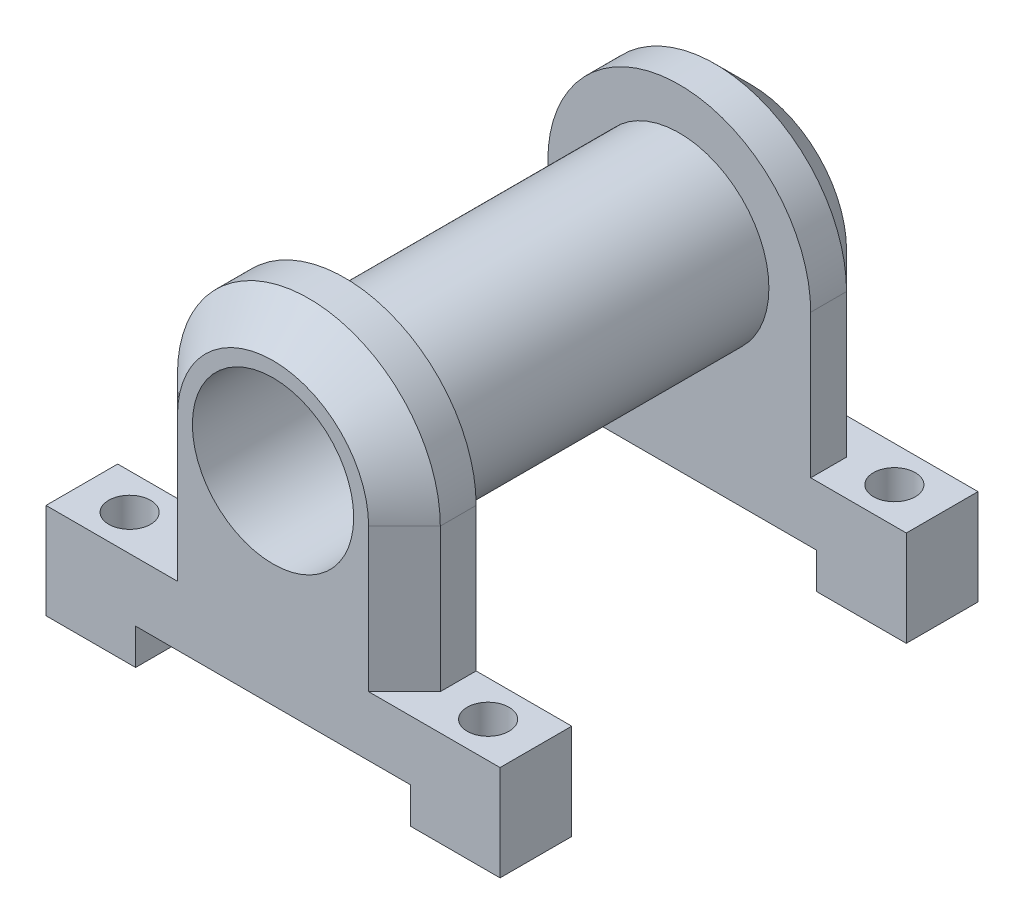
ISO-10303-21;
HEADER;
FILE_DESCRIPTION(('STEP AP214'),'2;1');
FILE_NAME('part.step','',(''),(''),'','','');
FILE_SCHEMA(('AUTOMOTIVE_DESIGN { 1 0 10303 214 1 1 1 1 }'));
ENDSEC;
DATA;
#1=APPLICATION_CONTEXT('core data for automotive mechanical design processes');
#2=APPLICATION_PROTOCOL_DEFINITION('international standard','automotive_design',2000,#1);
#3=PRODUCT_CONTEXT('',#1,'mechanical');
#4=PRODUCT('Part','Part','',(#3));
#5=PRODUCT_RELATED_PRODUCT_CATEGORY('part','',(#4));
#6=PRODUCT_DEFINITION_FORMATION('','',#4);
#7=PRODUCT_DEFINITION_CONTEXT('part definition',#1,'design');
#8=PRODUCT_DEFINITION('design','',#6,#7);
#9=PRODUCT_DEFINITION_SHAPE('','',#8);
#10=(LENGTH_UNIT() NAMED_UNIT(*) SI_UNIT(.MILLI.,.METRE.));
#11=(NAMED_UNIT(*) PLANE_ANGLE_UNIT() SI_UNIT($,.RADIAN.));
#12=(NAMED_UNIT(*) SI_UNIT($,.STERADIAN.) SOLID_ANGLE_UNIT());
#13=UNCERTAINTY_MEASURE_WITH_UNIT(LENGTH_MEASURE(1.E-05),#10,'distance_accuracy_value','');
#14=(GEOMETRIC_REPRESENTATION_CONTEXT(3) GLOBAL_UNCERTAINTY_ASSIGNED_CONTEXT((#13)) GLOBAL_UNIT_ASSIGNED_CONTEXT((#10,
#11,#12)) REPRESENTATION_CONTEXT('',''));
#15=CARTESIAN_POINT('',(0.,0.,0.));
#16=DIRECTION('',(0.,0.,1.));
#17=DIRECTION('',(1.,0.,0.));
#18=AXIS2_PLACEMENT_3D('',#15,#16,#17);
#19=CARTESIAN_POINT('',(11.,-20.,6.));
#20=DIRECTION('',(0.,1.,0.));
#21=DIRECTION('',(-1.,0.,0.));
#22=AXIS2_PLACEMENT_3D('',#19,#20,#21);
#23=PLANE('',#22);
#24=CARTESIAN_POINT('',(15.,-20.,3.));
#25=DIRECTION('',(0.,1.,0.));
#26=DIRECTION('',(0.,0.,1.));
#27=AXIS2_PLACEMENT_3D('',#24,#25,#26);
#28=CIRCLE('',#27,1.75);
#29=CARTESIAN_POINT('',(15.,-20.,4.75));
#30=VERTEX_POINT('',#29);
#31=EDGE_CURVE('E672',#30,#30,#28,.T.);
#32=ORIENTED_EDGE('',*,*,#31,.T.);
#33=EDGE_LOOP('',(#32));
#34=FACE_BOUND('',#33,.T.);
#35=DIRECTION('',(1.,0.,0.));
#36=VECTOR('',#35,1.);
#37=CARTESIAN_POINT('',(-11.,-20.,6.));
#38=LINE('',#37,#36);
#39=CARTESIAN_POINT('',(11.5,-20.,6.));
#40=VERTEX_POINT('',#39);
#41=CARTESIAN_POINT('',(19.,-20.,6.));
#42=VERTEX_POINT('',#41);
#43=EDGE_CURVE('E323',#40,#42,#38,.T.);
#44=ORIENTED_EDGE('',*,*,#43,.F.);
#45=DIRECTION('',(0.,0.,-1.));
#46=VECTOR('',#45,1.);
#47=CARTESIAN_POINT('',(11.5,-20.,40.));
#48=LINE('',#47,#46);
#49=CARTESIAN_POINT('',(11.5,-20.,0.));
#50=VERTEX_POINT('',#49);
#51=EDGE_CURVE('E242',#40,#50,#48,.T.);
#52=ORIENTED_EDGE('',*,*,#51,.T.);
#53=DIRECTION('',(1.,0.,0.));
#54=VECTOR('',#53,1.);
#55=CARTESIAN_POINT('',(11.,-20.,0.));
#56=LINE('',#55,#54);
#57=CARTESIAN_POINT('',(19.,-20.,0.));
#58=VERTEX_POINT('',#57);
#59=EDGE_CURVE('E343',#50,#58,#56,.T.);
#60=ORIENTED_EDGE('',*,*,#59,.T.);
#61=DIRECTION('',(0.,0.,-1.));
#62=VECTOR('',#61,1.);
#63=CARTESIAN_POINT('',(19.,-20.,6.));
#64=LINE('',#63,#62);
#65=EDGE_CURVE('E366',#42,#58,#64,.T.);
#66=ORIENTED_EDGE('',*,*,#65,.F.);
#67=EDGE_LOOP('',(#44,#52,#60,#66));
#68=FACE_BOUND('',#67,.T.);
#69=ADVANCED_FACE('F39',(#34,#68),#23,.F.);
#70=CARTESIAN_POINT('',(-19.,-20.,40.));
#71=DIRECTION('',(0.,1.,0.));
#72=DIRECTION('',(0.,0.,1.));
#73=AXIS2_PLACEMENT_3D('',#70,#71,#72);
#74=PLANE('',#73);
#75=CARTESIAN_POINT('',(15.0000000000004,-20.,37.));
#76=DIRECTION('',(0.,1.,0.));
#77=DIRECTION('',(0.,0.,1.));
#78=AXIS2_PLACEMENT_3D('',#75,#76,#77);
#79=CIRCLE('',#78,1.75);
#80=CARTESIAN_POINT('',(15.0000000000004,-20.,38.75));
#81=VERTEX_POINT('',#80);
#82=EDGE_CURVE('E415',#81,#81,#79,.T.);
#83=ORIENTED_EDGE('',*,*,#82,.T.);
#84=EDGE_LOOP('',(#83));
#85=FACE_BOUND('',#84,.T.);
#86=DIRECTION('',(1.,0.,0.));
#87=VECTOR('',#86,1.);
#88=CARTESIAN_POINT('',(-19.,-20.,40.));
#89=LINE('',#88,#87);
#90=CARTESIAN_POINT('',(11.5,-20.,40.));
#91=VERTEX_POINT('',#90);
#92=CARTESIAN_POINT('',(19.,-20.,40.));
#93=VERTEX_POINT('',#92);
#94=EDGE_CURVE('E247',#91,#93,#89,.T.);
#95=ORIENTED_EDGE('',*,*,#94,.F.);
#96=CARTESIAN_POINT('',(11.5,-20.,34.));
#97=VERTEX_POINT('',#96);
#98=EDGE_CURVE('E230',#91,#97,#48,.T.);
#99=ORIENTED_EDGE('',*,*,#98,.T.);
#100=DIRECTION('',(1.,0.,0.));
#101=VECTOR('',#100,1.);
#102=CARTESIAN_POINT('',(-19.,-20.,34.));
#103=LINE('',#102,#101);
#104=CARTESIAN_POINT('',(19.,-20.,34.));
#105=VERTEX_POINT('',#104);
#106=EDGE_CURVE('E278',#97,#105,#103,.T.);
#107=ORIENTED_EDGE('',*,*,#106,.T.);
#108=DIRECTION('',(0.,0.,-1.));
#109=VECTOR('',#108,1.);
#110=CARTESIAN_POINT('',(19.,-20.,40.));
#111=LINE('',#110,#109);
#112=EDGE_CURVE('E257',#93,#105,#111,.T.);
#113=ORIENTED_EDGE('',*,*,#112,.F.);
#114=EDGE_LOOP('',(#95,#99,#107,#113));
#115=FACE_BOUND('',#114,.T.);
#116=ADVANCED_FACE('F255',(#85,#115),#74,.F.);
#117=CARTESIAN_POINT('',(-19.,-20.,6.));
#118=DIRECTION('',(1.,0.,0.));
#119=DIRECTION('',(0.,0.,-1.));
#120=AXIS2_PLACEMENT_3D('',#117,#118,#119);
#121=PLANE('',#120);
#122=DIRECTION('',(0.,-1.,0.));
#123=VECTOR('',#122,1.);
#124=CARTESIAN_POINT('',(-19.,-20.,0.));
#125=LINE('',#124,#123);
#126=CARTESIAN_POINT('',(-19.,-12.,0.));
#127=VERTEX_POINT('',#126);
#128=CARTESIAN_POINT('',(-19.,-20.,0.));
#129=VERTEX_POINT('',#128);
#130=EDGE_CURVE('E317',#127,#129,#125,.T.);
#131=ORIENTED_EDGE('',*,*,#130,.T.);
#132=DIRECTION('',(0.,0.,-1.));
#133=VECTOR('',#132,1.);
#134=CARTESIAN_POINT('',(-19.,-20.,6.));
#135=LINE('',#134,#133);
#136=CARTESIAN_POINT('',(-19.,-20.,6.));
#137=VERTEX_POINT('',#136);
#138=EDGE_CURVE('E369',#137,#129,#135,.T.);
#139=ORIENTED_EDGE('',*,*,#138,.F.);
#140=DIRECTION('',(0.,-1.,0.));
#141=VECTOR('',#140,1.);
#142=CARTESIAN_POINT('',(-19.,-20.,6.));
#143=LINE('',#142,#141);
#144=CARTESIAN_POINT('',(-19.,-12.,6.));
#145=VERTEX_POINT('',#144);
#146=EDGE_CURVE('E320',#145,#137,#143,.T.);
#147=ORIENTED_EDGE('',*,*,#146,.F.);
#148=DIRECTION('',(0.,0.,-1.));
#149=VECTOR('',#148,1.);
#150=CARTESIAN_POINT('',(-19.,-12.,6.));
#151=LINE('',#150,#149);
#152=EDGE_CURVE('E340',#145,#127,#151,.T.);
#153=ORIENTED_EDGE('',*,*,#152,.T.);
#154=EDGE_LOOP('',(#131,#139,#147,#153));
#155=FACE_BOUND('',#154,.T.);
#156=ADVANCED_FACE('F461',(#155),#121,.F.);
#157=CARTESIAN_POINT('',(-15.,-20.,3.));
#158=DIRECTION('',(0.,1.,0.));
#159=DIRECTION('',(0.,0.,1.));
#160=AXIS2_PLACEMENT_3D('',#157,#158,#159);
#161=CIRCLE('',#160,1.75);
#162=CARTESIAN_POINT('',(-15.,-20.,4.75));
#163=VERTEX_POINT('',#162);
#164=EDGE_CURVE('E253',#163,#163,#161,.T.);
#165=ORIENTED_EDGE('',*,*,#164,.T.);
#166=EDGE_LOOP('',(#165));
#167=FACE_BOUND('',#166,.T.);
#168=CARTESIAN_POINT('',(-11.5,-20.,0.));
#169=VERTEX_POINT('',#168);
#170=EDGE_CURVE('E344',#129,#169,#56,.T.);
#171=ORIENTED_EDGE('',*,*,#170,.T.);
#172=DIRECTION('',(0.,0.,-1.));
#173=VECTOR('',#172,1.);
#174=CARTESIAN_POINT('',(-11.5,-20.,40.));
#175=LINE('',#174,#173);
#176=CARTESIAN_POINT('',(-11.5,-20.,6.));
#177=VERTEX_POINT('',#176);
#178=EDGE_CURVE('E241',#177,#169,#175,.T.);
#179=ORIENTED_EDGE('',*,*,#178,.F.);
#180=EDGE_CURVE('E325',#137,#177,#38,.T.);
#181=ORIENTED_EDGE('',*,*,#180,.F.);
#182=ORIENTED_EDGE('',*,*,#138,.T.);
#183=EDGE_LOOP('',(#171,#179,#181,#182));
#184=FACE_BOUND('',#183,.T.);
#185=ADVANCED_FACE('F457',(#167,#184),#23,.F.);
#186=CARTESIAN_POINT('',(19.,-20.,6.));
#187=DIRECTION('',(-1.,0.,0.));
#188=DIRECTION('',(0.,0.,1.));
#189=AXIS2_PLACEMENT_3D('',#186,#187,#188);
#190=PLANE('',#189);
#191=DIRECTION('',(0.,1.,0.));
#192=VECTOR('',#191,1.);
#193=CARTESIAN_POINT('',(19.,-20.,0.));
#194=LINE('',#193,#192);
#195=CARTESIAN_POINT('',(19.,-12.,0.));
#196=VERTEX_POINT('',#195);
#197=EDGE_CURVE('E347',#58,#196,#194,.T.);
#198=ORIENTED_EDGE('',*,*,#197,.T.);
#199=DIRECTION('',(0.,0.,-1.));
#200=VECTOR('',#199,1.);
#201=CARTESIAN_POINT('',(19.,-12.,6.));
#202=LINE('',#201,#200);
#203=CARTESIAN_POINT('',(19.,-12.,6.));
#204=VERTEX_POINT('',#203);
#205=EDGE_CURVE('E363',#204,#196,#202,.T.);
#206=ORIENTED_EDGE('',*,*,#205,.F.);
#207=DIRECTION('',(0.,1.,0.));
#208=VECTOR('',#207,1.);
#209=CARTESIAN_POINT('',(19.,-20.,6.));
#210=LINE('',#209,#208);
#211=EDGE_CURVE('E328',#42,#204,#210,.T.);
#212=ORIENTED_EDGE('',*,*,#211,.F.);
#213=ORIENTED_EDGE('',*,*,#65,.T.);
#214=EDGE_LOOP('',(#198,#206,#212,#213));
#215=FACE_BOUND('',#214,.T.);
#216=ADVANCED_FACE('F470',(#215),#190,.F.);
#217=CARTESIAN_POINT('',(11.,-12.,6.));
#218=DIRECTION('',(0.,-1.,0.));
#219=DIRECTION('',(0.,0.,-1.));
#220=AXIS2_PLACEMENT_3D('',#217,#218,#219);
#221=PLANE('',#220);
#222=CARTESIAN_POINT('',(15.,-12.,3.));
#223=DIRECTION('',(0.,1.,0.));
#224=DIRECTION('',(0.,0.,1.));
#225=AXIS2_PLACEMENT_3D('',#222,#223,#224);
#226=CIRCLE('',#225,1.75);
#227=CARTESIAN_POINT('',(15.,-12.,4.75));
#228=VERTEX_POINT('',#227);
#229=EDGE_CURVE('E669',#228,#228,#226,.T.);
#230=ORIENTED_EDGE('',*,*,#229,.F.);
#231=EDGE_LOOP('',(#230));
#232=FACE_BOUND('',#231,.T.);
#233=DIRECTION('',(-1.,0.,0.));
#234=VECTOR('',#233,1.);
#235=CARTESIAN_POINT('',(11.,-12.,0.));
#236=LINE('',#235,#234);
#237=CARTESIAN_POINT('',(7.99999999999999,-12.,0.));
#238=VERTEX_POINT('',#237);
#239=EDGE_CURVE('E349',#196,#238,#236,.T.);
#240=ORIENTED_EDGE('',*,*,#239,.T.);
#241=DIRECTION('',(-0.707106781186548,0.,-0.707106781186547));
#242=VECTOR('',#241,1.);
#243=CARTESIAN_POINT('',(12.5,-12.,4.5));
#244=LINE('',#243,#242);
#245=CARTESIAN_POINT('',(11.,-12.,3.));
#246=VERTEX_POINT('',#245);
#247=EDGE_CURVE('E49',#238,#246,#244,.F.);
#248=ORIENTED_EDGE('',*,*,#247,.T.);
#249=DIRECTION('',(0.,0.,-1.));
#250=VECTOR('',#249,1.);
#251=CARTESIAN_POINT('',(11.,-12.,6.));
#252=LINE('',#251,#250);
#253=CARTESIAN_POINT('',(11.,-12.,6.));
#254=VERTEX_POINT('',#253);
#255=EDGE_CURVE('E360',#254,#246,#252,.T.);
#256=ORIENTED_EDGE('',*,*,#255,.F.);
#257=DIRECTION('',(-1.,0.,0.));
#258=VECTOR('',#257,1.);
#259=CARTESIAN_POINT('',(11.,-12.,6.));
#260=LINE('',#259,#258);
#261=EDGE_CURVE('E330',#204,#254,#260,.T.);
#262=ORIENTED_EDGE('',*,*,#261,.F.);
#263=ORIENTED_EDGE('',*,*,#205,.T.);
#264=EDGE_LOOP('',(#240,#248,#256,#262,#263));
#265=FACE_BOUND('',#264,.T.);
#266=ADVANCED_FACE('F451',(#232,#265),#221,.F.);
#267=CARTESIAN_POINT('',(11.,-12.,6.));
#268=DIRECTION('',(-1.,0.,0.));
#269=DIRECTION('',(0.,-1.,0.));
#270=AXIS2_PLACEMENT_3D('',#267,#268,#269);
#271=PLANE('',#270);
#272=ORIENTED_EDGE('',*,*,#255,.T.);
#273=DIRECTION('',(0.,1.,0.));
#274=VECTOR('',#273,1.);
#275=CARTESIAN_POINT('',(11.,-12.,3.));
#276=LINE('',#275,#274);
#277=CARTESIAN_POINT('',(11.,0.,3.));
#278=VERTEX_POINT('',#277);
#279=EDGE_CURVE('E393',#246,#278,#276,.T.);
#280=ORIENTED_EDGE('',*,*,#279,.T.);
#281=DIRECTION('',(0.,0.,-1.));
#282=VECTOR('',#281,1.);
#283=CARTESIAN_POINT('',(11.,0.,6.));
#284=LINE('',#283,#282);
#285=CARTESIAN_POINT('',(11.,0.,6.));
#286=VERTEX_POINT('',#285);
#287=EDGE_CURVE('E358',#286,#278,#284,.T.);
#288=ORIENTED_EDGE('',*,*,#287,.F.);
#289=DIRECTION('',(0.,1.,0.));
#290=VECTOR('',#289,1.);
#291=CARTESIAN_POINT('',(11.,-12.,6.));
#292=LINE('',#291,#290);
#293=EDGE_CURVE('E332',#254,#286,#292,.T.);
#294=ORIENTED_EDGE('',*,*,#293,.F.);
#295=EDGE_LOOP('',(#272,#280,#288,#294));
#296=FACE_BOUND('',#295,.T.);
#297=ADVANCED_FACE('F444',(#296),#271,.F.);
#298=CARTESIAN_POINT('',(0.,0.,6.));
#299=DIRECTION('',(0.,0.,-1.));
#300=DIRECTION('',(-1.,0.,0.));
#301=AXIS2_PLACEMENT_3D('',#298,#299,#300);
#302=CYLINDRICAL_SURFACE('',#301,11.);
#303=ORIENTED_EDGE('',*,*,#287,.T.);
#304=CARTESIAN_POINT('',(0.,0.,3.));
#305=DIRECTION('',(0.,0.,1.));
#306=DIRECTION('',(1.,0.,0.));
#307=AXIS2_PLACEMENT_3D('',#304,#305,#306);
#308=CIRCLE('',#307,11.);
#309=CARTESIAN_POINT('',(-11.,0.,3.));
#310=VERTEX_POINT('',#309);
#311=EDGE_CURVE('E65',#278,#310,#308,.T.);
#312=ORIENTED_EDGE('',*,*,#311,.T.);
#313=DIRECTION('',(0.,0.,-1.));
#314=VECTOR('',#313,1.);
#315=CARTESIAN_POINT('',(-11.,0.,6.));
#316=LINE('',#315,#314);
#317=CARTESIAN_POINT('',(-11.,0.,6.));
#318=VERTEX_POINT('',#317);
#319=EDGE_CURVE('E356',#318,#310,#316,.T.);
#320=ORIENTED_EDGE('',*,*,#319,.F.);
#321=CARTESIAN_POINT('',(0.,0.,6.));
#322=DIRECTION('',(0.,0.,1.));
#323=DIRECTION('',(1.,0.,0.));
#324=AXIS2_PLACEMENT_3D('',#321,#322,#323);
#325=CIRCLE('',#324,11.);
#326=EDGE_CURVE('E334',#286,#318,#325,.T.);
#327=ORIENTED_EDGE('',*,*,#326,.F.);
#328=EDGE_LOOP('',(#303,#312,#320,#327));
#329=FACE_BOUND('',#328,.T.);
#330=ADVANCED_FACE('F442',(#329),#302,.T.);
#331=CARTESIAN_POINT('',(-11.,0.,6.));
#332=DIRECTION('',(1.,0.,0.));
#333=DIRECTION('',(0.,1.,0.));
#334=AXIS2_PLACEMENT_3D('',#331,#332,#333);
#335=PLANE('',#334);
#336=ORIENTED_EDGE('',*,*,#319,.T.);
#337=DIRECTION('',(0.,-1.,0.));
#338=VECTOR('',#337,1.);
#339=CARTESIAN_POINT('',(-11.,0.,3.));
#340=LINE('',#339,#338);
#341=CARTESIAN_POINT('',(-11.,-12.,3.));
#342=VERTEX_POINT('',#341);
#343=EDGE_CURVE('E57',#310,#342,#340,.T.);
#344=ORIENTED_EDGE('',*,*,#343,.T.);
#345=DIRECTION('',(0.,0.,-1.));
#346=VECTOR('',#345,1.);
#347=CARTESIAN_POINT('',(-11.,-12.,6.));
#348=LINE('',#347,#346);
#349=CARTESIAN_POINT('',(-11.,-12.,6.));
#350=VERTEX_POINT('',#349);
#351=EDGE_CURVE('E354',#350,#342,#348,.T.);
#352=ORIENTED_EDGE('',*,*,#351,.F.);
#353=DIRECTION('',(0.,-1.,0.));
#354=VECTOR('',#353,1.);
#355=CARTESIAN_POINT('',(-11.,0.,6.));
#356=LINE('',#355,#354);
#357=EDGE_CURVE('E336',#318,#350,#356,.T.);
#358=ORIENTED_EDGE('',*,*,#357,.F.);
#359=EDGE_LOOP('',(#336,#344,#352,#358));
#360=FACE_BOUND('',#359,.T.);
#361=ADVANCED_FACE('F434',(#360),#335,.F.);
#362=CARTESIAN_POINT('',(-11.,-12.,6.));
#363=DIRECTION('',(0.,-1.,0.));
#364=DIRECTION('',(0.,0.,-1.));
#365=AXIS2_PLACEMENT_3D('',#362,#363,#364);
#366=PLANE('',#365);
#367=CARTESIAN_POINT('',(-15.,-12.,3.));
#368=DIRECTION('',(0.,1.,0.));
#369=DIRECTION('',(0.,0.,1.));
#370=AXIS2_PLACEMENT_3D('',#367,#368,#369);
#371=CIRCLE('',#370,1.75);
#372=CARTESIAN_POINT('',(-15.,-12.,4.75));
#373=VERTEX_POINT('',#372);
#374=EDGE_CURVE('E667',#373,#373,#371,.T.);
#375=ORIENTED_EDGE('',*,*,#374,.F.);
#376=EDGE_LOOP('',(#375));
#377=FACE_BOUND('',#376,.T.);
#378=DIRECTION('',(-1.,0.,0.));
#379=VECTOR('',#378,1.);
#380=CARTESIAN_POINT('',(-11.,-12.,0.));
#381=LINE('',#380,#379);
#382=CARTESIAN_POINT('',(-7.99999999999999,-12.,0.));
#383=VERTEX_POINT('',#382);
#384=EDGE_CURVE('E324',#383,#127,#381,.T.);
#385=ORIENTED_EDGE('',*,*,#384,.T.);
#386=ORIENTED_EDGE('',*,*,#152,.F.);
#387=DIRECTION('',(-1.,0.,0.));
#388=VECTOR('',#387,1.);
#389=CARTESIAN_POINT('',(-11.,-12.,6.));
#390=LINE('',#389,#388);
#391=EDGE_CURVE('E338',#350,#145,#390,.T.);
#392=ORIENTED_EDGE('',*,*,#391,.F.);
#393=ORIENTED_EDGE('',*,*,#351,.T.);
#394=DIRECTION('',(-0.707106781186548,0.,0.707106781186547));
#395=VECTOR('',#394,1.);
#396=CARTESIAN_POINT('',(-12.5,-12.,4.5));
#397=LINE('',#396,#395);
#398=EDGE_CURVE('E11',#342,#383,#397,.F.);
#399=ORIENTED_EDGE('',*,*,#398,.T.);
#400=EDGE_LOOP('',(#385,#386,#392,#393,#399));
#401=FACE_BOUND('',#400,.T.);
#402=ADVANCED_FACE('F430',(#377,#401),#366,.F.);
#403=CARTESIAN_POINT('',(0.,0.,6.));
#404=DIRECTION('',(0.,0.,1.));
#405=DIRECTION('',(1.,0.,0.));
#406=AXIS2_PLACEMENT_3D('',#403,#404,#405);
#407=PLANE('',#406);
#408=DIRECTION('',(0.,1.,0.));
#409=VECTOR('',#408,1.);
#410=CARTESIAN_POINT('',(11.5,0.,6.));
#411=LINE('',#410,#409);
#412=CARTESIAN_POINT('',(11.5,-17.,6.));
#413=VERTEX_POINT('',#412);
#414=EDGE_CURVE('E507',#40,#413,#411,.T.);
#415=ORIENTED_EDGE('',*,*,#414,.F.);
#416=ORIENTED_EDGE('',*,*,#43,.T.);
#417=ORIENTED_EDGE('',*,*,#211,.T.);
#418=ORIENTED_EDGE('',*,*,#261,.T.);
#419=ORIENTED_EDGE('',*,*,#293,.T.);
#420=ORIENTED_EDGE('',*,*,#326,.T.);
#421=ORIENTED_EDGE('',*,*,#357,.T.);
#422=ORIENTED_EDGE('',*,*,#391,.T.);
#423=ORIENTED_EDGE('',*,*,#146,.T.);
#424=ORIENTED_EDGE('',*,*,#180,.T.);
#425=DIRECTION('',(0.,-1.,0.));
#426=VECTOR('',#425,1.);
#427=CARTESIAN_POINT('',(-11.5,0.,6.));
#428=LINE('',#427,#426);
#429=CARTESIAN_POINT('',(-11.5,-17.,6.));
#430=VERTEX_POINT('',#429);
#431=EDGE_CURVE('E494',#430,#177,#428,.T.);
#432=ORIENTED_EDGE('',*,*,#431,.F.);
#433=DIRECTION('',(-1.,0.,0.));
#434=VECTOR('',#433,1.);
#435=CARTESIAN_POINT('',(0.,-17.,6.));
#436=LINE('',#435,#434);
#437=EDGE_CURVE('E503',#413,#430,#436,.T.);
#438=ORIENTED_EDGE('',*,*,#437,.F.);
#439=EDGE_LOOP('',(#415,#416,#417,#418,#419,#420,#421,#422,#423,#424,#432,#438));
#440=FACE_BOUND('',#439,.T.);
#441=CARTESIAN_POINT('',(0.,0.,6.));
#442=DIRECTION('',(0.,0.,1.));
#443=DIRECTION('',(1.,0.,0.));
#444=AXIS2_PLACEMENT_3D('',#441,#442,#443);
#445=CIRCLE('',#444,7.5);
#446=CARTESIAN_POINT('',(7.5,0.,6.));
#447=VERTEX_POINT('',#446);
#448=EDGE_CURVE('E313',#447,#447,#445,.T.);
#449=ORIENTED_EDGE('',*,*,#448,.F.);
#450=EDGE_LOOP('',(#449));
#451=FACE_BOUND('',#450,.T.);
#452=ADVANCED_FACE('F437',(#440,#451),#407,.T.);
#453=CARTESIAN_POINT('',(0.,0.,0.));
#454=DIRECTION('',(0.,0.,1.));
#455=DIRECTION('',(1.,0.,0.));
#456=AXIS2_PLACEMENT_3D('',#453,#454,#455);
#457=PLANE('',#456);
#458=CARTESIAN_POINT('',(0.,0.,0.));
#459=DIRECTION('',(0.,0.,1.));
#460=DIRECTION('',(1.,0.,0.));
#461=AXIS2_PLACEMENT_3D('',#458,#459,#460);
#462=CIRCLE('',#461,6.75);
#463=CARTESIAN_POINT('',(6.75,0.,0.));
#464=VERTEX_POINT('',#463);
#465=EDGE_CURVE('E276',#464,#464,#462,.T.);
#466=ORIENTED_EDGE('',*,*,#465,.T.);
#467=EDGE_LOOP('',(#466));
#468=FACE_BOUND('',#467,.T.);
#469=DIRECTION('',(0.,-1.,0.));
#470=VECTOR('',#469,1.);
#471=CARTESIAN_POINT('',(7.99999999999999,0.,0.));
#472=LINE('',#471,#470);
#473=CARTESIAN_POINT('',(7.99999999999999,0.,0.));
#474=VERTEX_POINT('',#473);
#475=EDGE_CURVE('E400',#474,#238,#472,.T.);
#476=ORIENTED_EDGE('',*,*,#475,.T.);
#477=ORIENTED_EDGE('',*,*,#239,.F.);
#478=ORIENTED_EDGE('',*,*,#197,.F.);
#479=ORIENTED_EDGE('',*,*,#59,.F.);
#480=DIRECTION('',(0.,1.,0.));
#481=VECTOR('',#480,1.);
#482=CARTESIAN_POINT('',(11.5,0.,0.));
#483=LINE('',#482,#481);
#484=CARTESIAN_POINT('',(11.5,-17.,0.));
#485=VERTEX_POINT('',#484);
#486=EDGE_CURVE('E505',#50,#485,#483,.T.);
#487=ORIENTED_EDGE('',*,*,#486,.T.);
#488=DIRECTION('',(-1.,0.,0.));
#489=VECTOR('',#488,1.);
#490=CARTESIAN_POINT('',(0.,-17.,0.));
#491=LINE('',#490,#489);
#492=CARTESIAN_POINT('',(-11.5,-17.,0.));
#493=VERTEX_POINT('',#492);
#494=EDGE_CURVE('E490',#485,#493,#491,.T.);
#495=ORIENTED_EDGE('',*,*,#494,.T.);
#496=DIRECTION('',(0.,-1.,0.));
#497=VECTOR('',#496,1.);
#498=CARTESIAN_POINT('',(-11.5,0.,0.));
#499=LINE('',#498,#497);
#500=EDGE_CURVE('E488',#493,#169,#499,.T.);
#501=ORIENTED_EDGE('',*,*,#500,.T.);
#502=ORIENTED_EDGE('',*,*,#170,.F.);
#503=ORIENTED_EDGE('',*,*,#130,.F.);
#504=ORIENTED_EDGE('',*,*,#384,.F.);
#505=DIRECTION('',(0.,1.,0.));
#506=VECTOR('',#505,1.);
#507=CARTESIAN_POINT('',(-7.99999999999999,0.,0.));
#508=LINE('',#507,#506);
#509=CARTESIAN_POINT('',(-7.99999999999999,0.,0.));
#510=VERTEX_POINT('',#509);
#511=EDGE_CURVE('E396',#383,#510,#508,.T.);
#512=ORIENTED_EDGE('',*,*,#511,.T.);
#513=CARTESIAN_POINT('',(0.,0.,0.));
#514=DIRECTION('',(0.,0.,1.));
#515=DIRECTION('',(1.,0.,0.));
#516=AXIS2_PLACEMENT_3D('',#513,#514,#515);
#517=CIRCLE('',#516,7.99999999999999);
#518=EDGE_CURVE('E398',#510,#474,#517,.F.);
#519=ORIENTED_EDGE('',*,*,#518,.T.);
#520=EDGE_LOOP('',(#476,#477,#478,#479,#487,#495,#501,#502,#503,#504,#512,#519));
#521=FACE_BOUND('',#520,.T.);
#522=ADVANCED_FACE('F486',(#468,#521),#457,.F.);
#523=CARTESIAN_POINT('',(0.,0.,34.));
#524=DIRECTION('',(0.,0.,-1.));
#525=DIRECTION('',(-1.,0.,0.));
#526=AXIS2_PLACEMENT_3D('',#523,#524,#525);
#527=CYLINDRICAL_SURFACE('',#526,7.5);
#528=CARTESIAN_POINT('',(0.,0.,34.));
#529=DIRECTION('',(0.,0.,1.));
#530=DIRECTION('',(1.,0.,0.));
#531=AXIS2_PLACEMENT_3D('',#528,#529,#530);
#532=CIRCLE('',#531,7.5);
#533=CARTESIAN_POINT('',(7.5,0.,34.));
#534=VERTEX_POINT('',#533);
#535=EDGE_CURVE('E314',#534,#534,#532,.T.);
#536=ORIENTED_EDGE('',*,*,#535,.F.);
#537=EDGE_LOOP('',(#536));
#538=FACE_BOUND('',#537,.T.);
#539=ORIENTED_EDGE('',*,*,#448,.T.);
#540=EDGE_LOOP('',(#539));
#541=FACE_BOUND('',#540,.T.);
#542=ADVANCED_FACE('F651',(#538,#541),#527,.T.);
#543=CARTESIAN_POINT('',(-11.,-12.,40.));
#544=DIRECTION('',(0.,-1.,0.));
#545=DIRECTION('',(0.,0.,-1.));
#546=AXIS2_PLACEMENT_3D('',#543,#544,#545);
#547=PLANE('',#546);
#548=CARTESIAN_POINT('',(-14.9999999999996,-12.,37.));
#549=DIRECTION('',(0.,1.,0.));
#550=DIRECTION('',(0.,0.,1.));
#551=AXIS2_PLACEMENT_3D('',#548,#549,#550);
#552=CIRCLE('',#551,1.75);
#553=CARTESIAN_POINT('',(-14.9999999999996,-12.,38.75));
#554=VERTEX_POINT('',#553);
#555=EDGE_CURVE('E678',#554,#554,#552,.T.);
#556=ORIENTED_EDGE('',*,*,#555,.F.);
#557=EDGE_LOOP('',(#556));
#558=FACE_BOUND('',#557,.T.);
#559=DIRECTION('',(-1.,0.,0.));
#560=VECTOR('',#559,1.);
#561=CARTESIAN_POINT('',(-11.,-12.,34.));
#562=LINE('',#561,#560);
#563=CARTESIAN_POINT('',(-11.,-12.,34.));
#564=VERTEX_POINT('',#563);
#565=CARTESIAN_POINT('',(-19.,-12.,34.));
#566=VERTEX_POINT('',#565);
#567=EDGE_CURVE('E272',#564,#566,#562,.T.);
#568=ORIENTED_EDGE('',*,*,#567,.T.);
#569=DIRECTION('',(0.,0.,-1.));
#570=VECTOR('',#569,1.);
#571=CARTESIAN_POINT('',(-19.,-12.,40.));
#572=LINE('',#571,#570);
#573=CARTESIAN_POINT('',(-19.,-12.,40.));
#574=VERTEX_POINT('',#573);
#575=EDGE_CURVE('E310',#574,#566,#572,.T.);
#576=ORIENTED_EDGE('',*,*,#575,.F.);
#577=DIRECTION('',(-1.,0.,0.));
#578=VECTOR('',#577,1.);
#579=CARTESIAN_POINT('',(-11.,-12.,40.));
#580=LINE('',#579,#578);
#581=CARTESIAN_POINT('',(-7.99999999999999,-12.,40.));
#582=VERTEX_POINT('',#581);
#583=EDGE_CURVE('E264',#582,#574,#580,.T.);
#584=ORIENTED_EDGE('',*,*,#583,.F.);
#585=DIRECTION('',(-0.707106781186547,0.,-0.707106781186548));
#586=VECTOR('',#585,1.);
#587=CARTESIAN_POINT('',(-9.49999999999999,-12.,38.5));
#588=LINE('',#587,#586);
#589=CARTESIAN_POINT('',(-11.,-12.,37.));
#590=VERTEX_POINT('',#589);
#591=EDGE_CURVE('E408',#582,#590,#588,.T.);
#592=ORIENTED_EDGE('',*,*,#591,.T.);
#593=DIRECTION('',(0.,0.,-1.));
#594=VECTOR('',#593,1.);
#595=CARTESIAN_POINT('',(-11.,-12.,40.));
#596=LINE('',#595,#594);
#597=EDGE_CURVE('E271',#590,#564,#596,.T.);
#598=ORIENTED_EDGE('',*,*,#597,.T.);
#599=EDGE_LOOP('',(#568,#576,#584,#592,#598));
#600=FACE_BOUND('',#599,.T.);
#601=ADVANCED_FACE('F519',(#558,#600),#547,.F.);
#602=CARTESIAN_POINT('',(-19.,-12.,40.));
#603=DIRECTION('',(1.,0.,0.));
#604=DIRECTION('',(0.,0.,-1.));
#605=AXIS2_PLACEMENT_3D('',#602,#603,#604);
#606=PLANE('',#605);
#607=DIRECTION('',(0.,-1.,0.));
#608=VECTOR('',#607,1.);
#609=CARTESIAN_POINT('',(-19.,-12.,34.));
#610=LINE('',#609,#608);
#611=CARTESIAN_POINT('',(-19.,-20.,34.));
#612=VERTEX_POINT('',#611);
#613=EDGE_CURVE('E275',#566,#612,#610,.T.);
#614=ORIENTED_EDGE('',*,*,#613,.T.);
#615=DIRECTION('',(0.,0.,-1.));
#616=VECTOR('',#615,1.);
#617=CARTESIAN_POINT('',(-19.,-20.,40.));
#618=LINE('',#617,#616);
#619=CARTESIAN_POINT('',(-19.,-20.,40.));
#620=VERTEX_POINT('',#619);
#621=EDGE_CURVE('E307',#620,#612,#618,.T.);
#622=ORIENTED_EDGE('',*,*,#621,.F.);
#623=DIRECTION('',(0.,-1.,0.));
#624=VECTOR('',#623,1.);
#625=CARTESIAN_POINT('',(-19.,-12.,40.));
#626=LINE('',#625,#624);
#627=EDGE_CURVE('E260',#574,#620,#626,.T.);
#628=ORIENTED_EDGE('',*,*,#627,.F.);
#629=ORIENTED_EDGE('',*,*,#575,.T.);
#630=EDGE_LOOP('',(#614,#622,#628,#629));
#631=FACE_BOUND('',#630,.T.);
#632=ADVANCED_FACE('F522',(#631),#606,.F.);
#633=CARTESIAN_POINT('',(-14.9999999999996,-20.,37.));
#634=DIRECTION('',(0.,1.,0.));
#635=DIRECTION('',(0.,0.,1.));
#636=AXIS2_PLACEMENT_3D('',#633,#634,#635);
#637=CIRCLE('',#636,1.75);
#638=CARTESIAN_POINT('',(-14.9999999999996,-20.,38.75));
#639=VERTEX_POINT('',#638);
#640=EDGE_CURVE('E675',#639,#639,#637,.T.);
#641=ORIENTED_EDGE('',*,*,#640,.T.);
#642=EDGE_LOOP('',(#641));
#643=FACE_BOUND('',#642,.T.);
#644=CARTESIAN_POINT('',(-11.5,-20.,34.));
#645=VERTEX_POINT('',#644);
#646=EDGE_CURVE('E279',#612,#645,#103,.T.);
#647=ORIENTED_EDGE('',*,*,#646,.T.);
#648=CARTESIAN_POINT('',(-11.5,-20.,40.));
#649=VERTEX_POINT('',#648);
#650=EDGE_CURVE('E527',#649,#645,#175,.T.);
#651=ORIENTED_EDGE('',*,*,#650,.F.);
#652=EDGE_CURVE('E259',#620,#649,#89,.T.);
#653=ORIENTED_EDGE('',*,*,#652,.F.);
#654=ORIENTED_EDGE('',*,*,#621,.T.);
#655=EDGE_LOOP('',(#647,#651,#653,#654));
#656=FACE_BOUND('',#655,.T.);
#657=ADVANCED_FACE('F464',(#643,#656),#74,.F.);
#658=CARTESIAN_POINT('',(19.,-20.,40.));
#659=DIRECTION('',(-1.,0.,0.));
#660=DIRECTION('',(0.,0.,1.));
#661=AXIS2_PLACEMENT_3D('',#658,#659,#660);
#662=PLANE('',#661);
#663=DIRECTION('',(0.,1.,0.));
#664=VECTOR('',#663,1.);
#665=CARTESIAN_POINT('',(19.,-20.,34.));
#666=LINE('',#665,#664);
#667=CARTESIAN_POINT('',(19.,-12.,34.));
#668=VERTEX_POINT('',#667);
#669=EDGE_CURVE('E282',#105,#668,#666,.T.);
#670=ORIENTED_EDGE('',*,*,#669,.T.);
#671=DIRECTION('',(0.,0.,-1.));
#672=VECTOR('',#671,1.);
#673=CARTESIAN_POINT('',(19.,-12.,40.));
#674=LINE('',#673,#672);
#675=CARTESIAN_POINT('',(19.,-12.,40.));
#676=VERTEX_POINT('',#675);
#677=EDGE_CURVE('E303',#676,#668,#674,.T.);
#678=ORIENTED_EDGE('',*,*,#677,.F.);
#679=DIRECTION('',(0.,1.,0.));
#680=VECTOR('',#679,1.);
#681=CARTESIAN_POINT('',(19.,-20.,40.));
#682=LINE('',#681,#680);
#683=EDGE_CURVE('E263',#93,#676,#682,.T.);
#684=ORIENTED_EDGE('',*,*,#683,.F.);
#685=ORIENTED_EDGE('',*,*,#112,.T.);
#686=EDGE_LOOP('',(#670,#678,#684,#685));
#687=FACE_BOUND('',#686,.T.);
#688=ADVANCED_FACE('F615',(#687),#662,.F.);
#689=CARTESIAN_POINT('',(19.,-12.,40.));
#690=DIRECTION('',(0.,-1.,0.));
#691=DIRECTION('',(0.,0.,-1.));
#692=AXIS2_PLACEMENT_3D('',#689,#690,#691);
#693=PLANE('',#692);
#694=CARTESIAN_POINT('',(15.0000000000004,-12.,37.));
#695=DIRECTION('',(0.,1.,0.));
#696=DIRECTION('',(0.,0.,1.));
#697=AXIS2_PLACEMENT_3D('',#694,#695,#696);
#698=CIRCLE('',#697,1.75);
#699=CARTESIAN_POINT('',(15.0000000000004,-12.,38.75));
#700=VERTEX_POINT('',#699);
#701=EDGE_CURVE('E679',#700,#700,#698,.T.);
#702=ORIENTED_EDGE('',*,*,#701,.F.);
#703=EDGE_LOOP('',(#702));
#704=FACE_BOUND('',#703,.T.);
#705=DIRECTION('',(-1.,0.,0.));
#706=VECTOR('',#705,1.);
#707=CARTESIAN_POINT('',(19.,-12.,34.));
#708=LINE('',#707,#706);
#709=CARTESIAN_POINT('',(11.,-12.,34.));
#710=VERTEX_POINT('',#709);
#711=EDGE_CURVE('E284',#668,#710,#708,.T.);
#712=ORIENTED_EDGE('',*,*,#711,.T.);
#713=DIRECTION('',(0.,0.,-1.));
#714=VECTOR('',#713,1.);
#715=CARTESIAN_POINT('',(11.,-12.,40.));
#716=LINE('',#715,#714);
#717=CARTESIAN_POINT('',(11.,-12.,37.));
#718=VERTEX_POINT('',#717);
#719=EDGE_CURVE('E301',#718,#710,#716,.T.);
#720=ORIENTED_EDGE('',*,*,#719,.F.);
#721=DIRECTION('',(-0.707106781186547,0.,0.707106781186548));
#722=VECTOR('',#721,1.);
#723=CARTESIAN_POINT('',(13.5,-12.,34.5));
#724=LINE('',#723,#722);
#725=CARTESIAN_POINT('',(7.99999999999999,-12.,40.));
#726=VERTEX_POINT('',#725);
#727=EDGE_CURVE('E405',#718,#726,#724,.T.);
#728=ORIENTED_EDGE('',*,*,#727,.T.);
#729=DIRECTION('',(-1.,0.,0.));
#730=VECTOR('',#729,1.);
#731=CARTESIAN_POINT('',(19.,-12.,40.));
#732=LINE('',#731,#730);
#733=EDGE_CURVE('E269',#676,#726,#732,.T.);
#734=ORIENTED_EDGE('',*,*,#733,.F.);
#735=ORIENTED_EDGE('',*,*,#677,.T.);
#736=EDGE_LOOP('',(#712,#720,#728,#734,#735));
#737=FACE_BOUND('',#736,.T.);
#738=ADVANCED_FACE('F622',(#704,#737),#693,.F.);
#739=CARTESIAN_POINT('',(11.,-12.,40.));
#740=DIRECTION('',(-1.,0.,0.));
#741=DIRECTION('',(0.,-1.,0.));
#742=AXIS2_PLACEMENT_3D('',#739,#740,#741);
#743=PLANE('',#742);
#744=DIRECTION('',(0.,0.,-1.));
#745=VECTOR('',#744,1.);
#746=CARTESIAN_POINT('',(11.,0.,40.));
#747=LINE('',#746,#745);
#748=CARTESIAN_POINT('',(11.,0.,37.));
#749=VERTEX_POINT('',#748);
#750=CARTESIAN_POINT('',(11.,0.,34.));
#751=VERTEX_POINT('',#750);
#752=EDGE_CURVE('E299',#749,#751,#747,.T.);
#753=ORIENTED_EDGE('',*,*,#752,.F.);
#754=DIRECTION('',(0.,-1.,0.));
#755=VECTOR('',#754,1.);
#756=CARTESIAN_POINT('',(11.,-12.,37.));
#757=LINE('',#756,#755);
#758=EDGE_CURVE('E387',#749,#718,#757,.T.);
#759=ORIENTED_EDGE('',*,*,#758,.T.);
#760=ORIENTED_EDGE('',*,*,#719,.T.);
#761=DIRECTION('',(0.,1.,0.));
#762=VECTOR('',#761,1.);
#763=CARTESIAN_POINT('',(11.,-12.,34.));
#764=LINE('',#763,#762);
#765=EDGE_CURVE('E287',#710,#751,#764,.T.);
#766=ORIENTED_EDGE('',*,*,#765,.T.);
#767=EDGE_LOOP('',(#753,#759,#760,#766));
#768=FACE_BOUND('',#767,.T.);
#769=ADVANCED_FACE('F626',(#768),#743,.F.);
#770=CARTESIAN_POINT('',(0.,0.,40.));
#771=DIRECTION('',(0.,0.,-1.));
#772=DIRECTION('',(-1.,0.,0.));
#773=AXIS2_PLACEMENT_3D('',#770,#771,#772);
#774=CYLINDRICAL_SURFACE('',#773,11.);
#775=DIRECTION('',(0.,0.,-1.));
#776=VECTOR('',#775,1.);
#777=CARTESIAN_POINT('',(-11.,0.,40.));
#778=LINE('',#777,#776);
#779=CARTESIAN_POINT('',(-11.,0.,37.));
#780=VERTEX_POINT('',#779);
#781=CARTESIAN_POINT('',(-11.,0.,34.));
#782=VERTEX_POINT('',#781);
#783=EDGE_CURVE('E297',#780,#782,#778,.T.);
#784=ORIENTED_EDGE('',*,*,#783,.F.);
#785=CARTESIAN_POINT('',(0.,0.,37.));
#786=DIRECTION('',(0.,0.,1.));
#787=DIRECTION('',(1.,0.,0.));
#788=AXIS2_PLACEMENT_3D('',#785,#786,#787);
#789=CIRCLE('',#788,11.);
#790=EDGE_CURVE('E389',#780,#749,#789,.F.);
#791=ORIENTED_EDGE('',*,*,#790,.T.);
#792=ORIENTED_EDGE('',*,*,#752,.T.);
#793=CARTESIAN_POINT('',(0.,0.,34.));
#794=DIRECTION('',(0.,0.,1.));
#795=DIRECTION('',(1.,0.,0.));
#796=AXIS2_PLACEMENT_3D('',#793,#794,#795);
#797=CIRCLE('',#796,11.);
#798=EDGE_CURVE('E290',#751,#782,#797,.T.);
#799=ORIENTED_EDGE('',*,*,#798,.T.);
#800=EDGE_LOOP('',(#784,#791,#792,#799));
#801=FACE_BOUND('',#800,.T.);
#802=ADVANCED_FACE('F629',(#801),#774,.T.);
#803=CARTESIAN_POINT('',(-11.,0.,40.));
#804=DIRECTION('',(1.,0.,0.));
#805=DIRECTION('',(0.,1.,0.));
#806=AXIS2_PLACEMENT_3D('',#803,#804,#805);
#807=PLANE('',#806);
#808=ORIENTED_EDGE('',*,*,#597,.F.);
#809=DIRECTION('',(0.,1.,0.));
#810=VECTOR('',#809,1.);
#811=CARTESIAN_POINT('',(-11.,0.,37.));
#812=LINE('',#811,#810);
#813=EDGE_CURVE('E391',#590,#780,#812,.T.);
#814=ORIENTED_EDGE('',*,*,#813,.T.);
#815=ORIENTED_EDGE('',*,*,#783,.T.);
#816=DIRECTION('',(0.,-1.,0.));
#817=VECTOR('',#816,1.);
#818=CARTESIAN_POINT('',(-11.,0.,34.));
#819=LINE('',#818,#817);
#820=EDGE_CURVE('E293',#782,#564,#819,.T.);
#821=ORIENTED_EDGE('',*,*,#820,.T.);
#822=EDGE_LOOP('',(#808,#814,#815,#821));
#823=FACE_BOUND('',#822,.T.);
#824=ADVANCED_FACE('F603',(#823),#807,.F.);
#825=CARTESIAN_POINT('',(0.,0.,40.));
#826=DIRECTION('',(0.,0.,1.));
#827=DIRECTION('',(1.,0.,0.));
#828=AXIS2_PLACEMENT_3D('',#825,#826,#827);
#829=PLANE('',#828);
#830=ORIENTED_EDGE('',*,*,#733,.T.);
#831=DIRECTION('',(0.,1.,0.));
#832=VECTOR('',#831,1.);
#833=CARTESIAN_POINT('',(8.,0.,40.));
#834=LINE('',#833,#832);
#835=CARTESIAN_POINT('',(8.,0.,40.));
#836=VERTEX_POINT('',#835);
#837=EDGE_CURVE('E384',#726,#836,#834,.T.);
#838=ORIENTED_EDGE('',*,*,#837,.T.);
#839=CARTESIAN_POINT('',(0.,0.,40.));
#840=DIRECTION('',(0.,0.,1.));
#841=DIRECTION('',(1.,0.,0.));
#842=AXIS2_PLACEMENT_3D('',#839,#840,#841);
#843=CIRCLE('',#842,8.);
#844=CARTESIAN_POINT('',(-8.,0.,40.));
#845=VERTEX_POINT('',#844);
#846=EDGE_CURVE('E382',#836,#845,#843,.T.);
#847=ORIENTED_EDGE('',*,*,#846,.T.);
#848=DIRECTION('',(0.,-1.,0.));
#849=VECTOR('',#848,1.);
#850=CARTESIAN_POINT('',(-7.99999999999999,-12.,40.));
#851=LINE('',#850,#849);
#852=EDGE_CURVE('E379',#845,#582,#851,.T.);
#853=ORIENTED_EDGE('',*,*,#852,.T.);
#854=ORIENTED_EDGE('',*,*,#583,.T.);
#855=ORIENTED_EDGE('',*,*,#627,.T.);
#856=ORIENTED_EDGE('',*,*,#652,.T.);
#857=DIRECTION('',(0.,1.,0.));
#858=VECTOR('',#857,1.);
#859=CARTESIAN_POINT('',(-11.5,-20.,40.));
#860=LINE('',#859,#858);
#861=CARTESIAN_POINT('',(-11.5,-17.,40.));
#862=VERTEX_POINT('',#861);
#863=EDGE_CURVE('E252',#649,#862,#860,.T.);
#864=ORIENTED_EDGE('',*,*,#863,.T.);
#865=DIRECTION('',(1.,0.,0.));
#866=VECTOR('',#865,1.);
#867=CARTESIAN_POINT('',(11.5,-17.,40.));
#868=LINE('',#867,#866);
#869=CARTESIAN_POINT('',(11.5,-17.,40.));
#870=VERTEX_POINT('',#869);
#871=EDGE_CURVE('E251',#862,#870,#868,.T.);
#872=ORIENTED_EDGE('',*,*,#871,.T.);
#873=DIRECTION('',(0.,-1.,0.));
#874=VECTOR('',#873,1.);
#875=CARTESIAN_POINT('',(11.5,-20.,40.));
#876=LINE('',#875,#874);
#877=EDGE_CURVE('E234',#870,#91,#876,.T.);
#878=ORIENTED_EDGE('',*,*,#877,.T.);
#879=ORIENTED_EDGE('',*,*,#94,.T.);
#880=ORIENTED_EDGE('',*,*,#683,.T.);
#881=EDGE_LOOP('',(#830,#838,#847,#853,#854,#855,#856,#864,#872,#878,#879,#880));
#882=FACE_BOUND('',#881,.T.);
#883=CARTESIAN_POINT('',(0.,0.,40.));
#884=DIRECTION('',(0.,0.,1.));
#885=DIRECTION('',(1.,0.,0.));
#886=AXIS2_PLACEMENT_3D('',#883,#884,#885);
#887=CIRCLE('',#886,6.75);
#888=CARTESIAN_POINT('',(6.75,0.,40.));
#889=VERTEX_POINT('',#888);
#890=EDGE_CURVE('E509',#889,#889,#887,.T.);
#891=ORIENTED_EDGE('',*,*,#890,.F.);
#892=EDGE_LOOP('',(#891));
#893=FACE_BOUND('',#892,.T.);
#894=ADVANCED_FACE('F245',(#882,#893),#829,.T.);
#895=CARTESIAN_POINT('',(0.,0.,34.));
#896=DIRECTION('',(0.,0.,1.));
#897=DIRECTION('',(1.,0.,0.));
#898=AXIS2_PLACEMENT_3D('',#895,#896,#897);
#899=PLANE('',#898);
#900=ORIENTED_EDGE('',*,*,#535,.T.);
#901=EDGE_LOOP('',(#900));
#902=FACE_BOUND('',#901,.T.);
#903=ORIENTED_EDGE('',*,*,#106,.F.);
#904=DIRECTION('',(0.,1.,0.));
#905=VECTOR('',#904,1.);
#906=CARTESIAN_POINT('',(11.5,0.,34.));
#907=LINE('',#906,#905);
#908=CARTESIAN_POINT('',(11.5,-17.,34.));
#909=VERTEX_POINT('',#908);
#910=EDGE_CURVE('E237',#97,#909,#907,.T.);
#911=ORIENTED_EDGE('',*,*,#910,.T.);
#912=DIRECTION('',(-1.,0.,0.));
#913=VECTOR('',#912,1.);
#914=CARTESIAN_POINT('',(0.,-17.,34.));
#915=LINE('',#914,#913);
#916=CARTESIAN_POINT('',(-11.5,-17.,34.));
#917=VERTEX_POINT('',#916);
#918=EDGE_CURVE('E375',#909,#917,#915,.T.);
#919=ORIENTED_EDGE('',*,*,#918,.T.);
#920=DIRECTION('',(0.,-1.,0.));
#921=VECTOR('',#920,1.);
#922=CARTESIAN_POINT('',(-11.5,0.,34.));
#923=LINE('',#922,#921);
#924=EDGE_CURVE('E372',#917,#645,#923,.T.);
#925=ORIENTED_EDGE('',*,*,#924,.T.);
#926=ORIENTED_EDGE('',*,*,#646,.F.);
#927=ORIENTED_EDGE('',*,*,#613,.F.);
#928=ORIENTED_EDGE('',*,*,#567,.F.);
#929=ORIENTED_EDGE('',*,*,#820,.F.);
#930=ORIENTED_EDGE('',*,*,#798,.F.);
#931=ORIENTED_EDGE('',*,*,#765,.F.);
#932=ORIENTED_EDGE('',*,*,#711,.F.);
#933=ORIENTED_EDGE('',*,*,#669,.F.);
#934=EDGE_LOOP('',(#903,#911,#919,#925,#926,#927,#928,#929,#930,#931,#932,#933));
#935=FACE_BOUND('',#934,.T.);
#936=ADVANCED_FACE('F608',(#902,#935),#899,.F.);
#937=CARTESIAN_POINT('',(0.,0.,0.));
#938=DIRECTION('',(0.,0.,1.));
#939=DIRECTION('',(1.,0.,0.));
#940=AXIS2_PLACEMENT_3D('',#937,#938,#939);
#941=CYLINDRICAL_SURFACE('',#940,6.75);
#942=ORIENTED_EDGE('',*,*,#465,.F.);
#943=EDGE_LOOP('',(#942));
#944=FACE_BOUND('',#943,.T.);
#945=ORIENTED_EDGE('',*,*,#890,.T.);
#946=EDGE_LOOP('',(#945));
#947=FACE_BOUND('',#946,.T.);
#948=ADVANCED_FACE('F713',(#944,#947),#941,.F.);
#949=CARTESIAN_POINT('',(-11.5,-20.,40.));
#950=DIRECTION('',(-1.,0.,0.));
#951=DIRECTION('',(0.,0.,1.));
#952=AXIS2_PLACEMENT_3D('',#949,#950,#951);
#953=PLANE('',#952);
#954=DIRECTION('',(0.,0.,-1.));
#955=VECTOR('',#954,1.);
#956=CARTESIAN_POINT('',(-11.5,-17.,40.));
#957=LINE('',#956,#955);
#958=EDGE_CURVE('E533',#862,#917,#957,.T.);
#959=ORIENTED_EDGE('',*,*,#958,.F.);
#960=ORIENTED_EDGE('',*,*,#863,.F.);
#961=ORIENTED_EDGE('',*,*,#650,.T.);
#962=ORIENTED_EDGE('',*,*,#924,.F.);
#963=EDGE_LOOP('',(#959,#960,#961,#962));
#964=FACE_BOUND('',#963,.T.);
#965=ADVANCED_FACE('F609',(#964),#953,.F.);
#966=CARTESIAN_POINT('',(11.5,-17.,40.));
#967=DIRECTION('',(0.,1.,0.));
#968=DIRECTION('',(0.,0.,1.));
#969=AXIS2_PLACEMENT_3D('',#966,#967,#968);
#970=PLANE('',#969);
#971=DIRECTION('',(0.,0.,-1.));
#972=VECTOR('',#971,1.);
#973=CARTESIAN_POINT('',(11.5,-17.,40.));
#974=LINE('',#973,#972);
#975=EDGE_CURVE('E495',#870,#909,#974,.T.);
#976=ORIENTED_EDGE('',*,*,#975,.F.);
#977=ORIENTED_EDGE('',*,*,#871,.F.);
#978=ORIENTED_EDGE('',*,*,#958,.T.);
#979=ORIENTED_EDGE('',*,*,#918,.F.);
#980=EDGE_LOOP('',(#976,#977,#978,#979));
#981=FACE_BOUND('',#980,.T.);
#982=ADVANCED_FACE('F611',(#981),#970,.F.);
#983=CARTESIAN_POINT('',(11.5,-20.,40.));
#984=DIRECTION('',(1.,0.,0.));
#985=DIRECTION('',(0.,0.,-1.));
#986=AXIS2_PLACEMENT_3D('',#983,#984,#985);
#987=PLANE('',#986);
#988=ORIENTED_EDGE('',*,*,#98,.F.);
#989=ORIENTED_EDGE('',*,*,#877,.F.);
#990=ORIENTED_EDGE('',*,*,#975,.T.);
#991=ORIENTED_EDGE('',*,*,#910,.F.);
#992=EDGE_LOOP('',(#988,#989,#990,#991));
#993=FACE_BOUND('',#992,.T.);
#994=ADVANCED_FACE('F232',(#993),#987,.F.);
#995=ORIENTED_EDGE('',*,*,#414,.T.);
#996=EDGE_CURVE('E498',#413,#485,#974,.T.);
#997=ORIENTED_EDGE('',*,*,#996,.T.);
#998=ORIENTED_EDGE('',*,*,#486,.F.);
#999=ORIENTED_EDGE('',*,*,#51,.F.);
#1000=EDGE_LOOP('',(#995,#997,#998,#999));
#1001=FACE_BOUND('',#1000,.T.);
#1002=ADVANCED_FACE('F546',(#1001),#987,.F.);
#1003=ORIENTED_EDGE('',*,*,#437,.T.);
#1004=EDGE_CURVE('E535',#430,#493,#957,.T.);
#1005=ORIENTED_EDGE('',*,*,#1004,.T.);
#1006=ORIENTED_EDGE('',*,*,#494,.F.);
#1007=ORIENTED_EDGE('',*,*,#996,.F.);
#1008=EDGE_LOOP('',(#1003,#1005,#1006,#1007));
#1009=FACE_BOUND('',#1008,.T.);
#1010=ADVANCED_FACE('F543',(#1009),#970,.F.);
#1011=ORIENTED_EDGE('',*,*,#431,.T.);
#1012=ORIENTED_EDGE('',*,*,#178,.T.);
#1013=ORIENTED_EDGE('',*,*,#500,.F.);
#1014=ORIENTED_EDGE('',*,*,#1004,.F.);
#1015=EDGE_LOOP('',(#1011,#1012,#1013,#1014));
#1016=FACE_BOUND('',#1015,.T.);
#1017=ADVANCED_FACE('F536',(#1016),#953,.F.);
#1018=CARTESIAN_POINT('',(15.0000000000004,-20.,37.));
#1019=DIRECTION('',(0.,1.,0.));
#1020=DIRECTION('',(0.,0.,1.));
#1021=AXIS2_PLACEMENT_3D('',#1018,#1019,#1020);
#1022=CYLINDRICAL_SURFACE('',#1021,1.75);
#1023=ORIENTED_EDGE('',*,*,#82,.F.);
#1024=EDGE_LOOP('',(#1023));
#1025=FACE_BOUND('',#1024,.T.);
#1026=ORIENTED_EDGE('',*,*,#701,.T.);
#1027=EDGE_LOOP('',(#1026));
#1028=FACE_BOUND('',#1027,.T.);
#1029=ADVANCED_FACE('F688',(#1025,#1028),#1022,.F.);
#1030=CARTESIAN_POINT('',(-14.9999999999996,-20.,37.));
#1031=DIRECTION('',(0.,1.,0.));
#1032=DIRECTION('',(0.,0.,1.));
#1033=AXIS2_PLACEMENT_3D('',#1030,#1031,#1032);
#1034=CYLINDRICAL_SURFACE('',#1033,1.75);
#1035=ORIENTED_EDGE('',*,*,#640,.F.);
#1036=EDGE_LOOP('',(#1035));
#1037=FACE_BOUND('',#1036,.T.);
#1038=ORIENTED_EDGE('',*,*,#555,.T.);
#1039=EDGE_LOOP('',(#1038));
#1040=FACE_BOUND('',#1039,.T.);
#1041=ADVANCED_FACE('F690',(#1037,#1040),#1034,.F.);
#1042=CARTESIAN_POINT('',(-15.,-20.,3.));
#1043=DIRECTION('',(0.,1.,0.));
#1044=DIRECTION('',(0.,0.,1.));
#1045=AXIS2_PLACEMENT_3D('',#1042,#1043,#1044);
#1046=CYLINDRICAL_SURFACE('',#1045,1.75);
#1047=ORIENTED_EDGE('',*,*,#164,.F.);
#1048=EDGE_LOOP('',(#1047));
#1049=FACE_BOUND('',#1048,.T.);
#1050=ORIENTED_EDGE('',*,*,#374,.T.);
#1051=EDGE_LOOP('',(#1050));
#1052=FACE_BOUND('',#1051,.T.);
#1053=ADVANCED_FACE('F697',(#1049,#1052),#1046,.F.);
#1054=CARTESIAN_POINT('',(15.,-20.,3.));
#1055=DIRECTION('',(0.,1.,0.));
#1056=DIRECTION('',(0.,0.,1.));
#1057=AXIS2_PLACEMENT_3D('',#1054,#1055,#1056);
#1058=CYLINDRICAL_SURFACE('',#1057,1.75);
#1059=ORIENTED_EDGE('',*,*,#31,.F.);
#1060=EDGE_LOOP('',(#1059));
#1061=FACE_BOUND('',#1060,.T.);
#1062=ORIENTED_EDGE('',*,*,#229,.T.);
#1063=EDGE_LOOP('',(#1062));
#1064=FACE_BOUND('',#1063,.T.);
#1065=ADVANCED_FACE('F594',(#1061,#1064),#1058,.F.);
#1066=CARTESIAN_POINT('',(-8.,0.,40.));
#1067=DIRECTION('',(-0.707106781186548,0.,0.707106781186547));
#1068=DIRECTION('',(0.,1.,0.));
#1069=AXIS2_PLACEMENT_3D('',#1066,#1067,#1068);
#1070=PLANE('',#1069);
#1071=ORIENTED_EDGE('',*,*,#591,.F.);
#1072=ORIENTED_EDGE('',*,*,#852,.F.);
#1073=DIRECTION('',(0.707106781186547,0.,0.707106781186548));
#1074=VECTOR('',#1073,1.);
#1075=CARTESIAN_POINT('',(-11.,0.,37.));
#1076=LINE('',#1075,#1074);
#1077=EDGE_CURVE('E413',#780,#845,#1076,.T.);
#1078=ORIENTED_EDGE('',*,*,#1077,.F.);
#1079=ORIENTED_EDGE('',*,*,#813,.F.);
#1080=EDGE_LOOP('',(#1071,#1072,#1078,#1079));
#1081=FACE_BOUND('',#1080,.T.);
#1082=ADVANCED_FACE('F570',(#1081),#1070,.T.);
#1083=CARTESIAN_POINT('',(0.,0.,40.));
#1084=DIRECTION('',(0.,0.,-1.));
#1085=DIRECTION('',(-1.,0.,0.));
#1086=AXIS2_PLACEMENT_3D('',#1083,#1084,#1085);
#1087=CONICAL_SURFACE('',#1086,8.,0.785398163397447);
#1088=ORIENTED_EDGE('',*,*,#1077,.T.);
#1089=ORIENTED_EDGE('',*,*,#846,.F.);
#1090=DIRECTION('',(-0.707106781186547,0.,0.707106781186548));
#1091=VECTOR('',#1090,1.);
#1092=CARTESIAN_POINT('',(11.,0.,37.));
#1093=LINE('',#1092,#1091);
#1094=EDGE_CURVE('E411',#749,#836,#1093,.T.);
#1095=ORIENTED_EDGE('',*,*,#1094,.F.);
#1096=ORIENTED_EDGE('',*,*,#790,.F.);
#1097=EDGE_LOOP('',(#1088,#1089,#1095,#1096));
#1098=FACE_BOUND('',#1097,.T.);
#1099=ADVANCED_FACE('F584',(#1098),#1087,.T.);
#1100=CARTESIAN_POINT('',(8.,0.,40.));
#1101=DIRECTION('',(0.707106781186548,0.,0.707106781186547));
#1102=DIRECTION('',(0.,-1.,0.));
#1103=AXIS2_PLACEMENT_3D('',#1100,#1101,#1102);
#1104=PLANE('',#1103);
#1105=ORIENTED_EDGE('',*,*,#727,.F.);
#1106=ORIENTED_EDGE('',*,*,#758,.F.);
#1107=ORIENTED_EDGE('',*,*,#1094,.T.);
#1108=ORIENTED_EDGE('',*,*,#837,.F.);
#1109=EDGE_LOOP('',(#1105,#1106,#1107,#1108));
#1110=FACE_BOUND('',#1109,.T.);
#1111=ADVANCED_FACE('F581',(#1110),#1104,.T.);
#1112=CARTESIAN_POINT('',(-11.,0.,3.));
#1113=DIRECTION('',(0.707106781186547,0.,0.707106781186548));
#1114=DIRECTION('',(0.,-1.,0.));
#1115=AXIS2_PLACEMENT_3D('',#1112,#1113,#1114);
#1116=PLANE('',#1115);
#1117=ORIENTED_EDGE('',*,*,#398,.F.);
#1118=ORIENTED_EDGE('',*,*,#343,.F.);
#1119=DIRECTION('',(-0.707106781186548,0.,0.707106781186547));
#1120=VECTOR('',#1119,1.);
#1121=CARTESIAN_POINT('',(-7.99999999999999,0.,0.));
#1122=LINE('',#1121,#1120);
#1123=EDGE_CURVE('E44',#510,#310,#1122,.T.);
#1124=ORIENTED_EDGE('',*,*,#1123,.F.);
#1125=ORIENTED_EDGE('',*,*,#511,.F.);
#1126=EDGE_LOOP('',(#1117,#1118,#1124,#1125));
#1127=FACE_BOUND('',#1126,.T.);
#1128=ADVANCED_FACE('F42',(#1127),#1116,.F.);
#1129=CARTESIAN_POINT('',(0.,0.,3.));
#1130=DIRECTION('',(0.,0.,1.));
#1131=DIRECTION('',(1.,0.,0.));
#1132=AXIS2_PLACEMENT_3D('',#1129,#1130,#1131);
#1133=CONICAL_SURFACE('',#1132,11.,0.785398163397449);
#1134=ORIENTED_EDGE('',*,*,#1123,.T.);
#1135=ORIENTED_EDGE('',*,*,#311,.F.);
#1136=DIRECTION('',(0.707106781186548,0.,0.707106781186547));
#1137=VECTOR('',#1136,1.);
#1138=CARTESIAN_POINT('',(7.99999999999999,0.,0.));
#1139=LINE('',#1138,#1137);
#1140=EDGE_CURVE('E416',#474,#278,#1139,.T.);
#1141=ORIENTED_EDGE('',*,*,#1140,.F.);
#1142=ORIENTED_EDGE('',*,*,#518,.F.);
#1143=EDGE_LOOP('',(#1134,#1135,#1141,#1142));
#1144=FACE_BOUND('',#1143,.T.);
#1145=ADVANCED_FACE('F425',(#1144),#1133,.T.);
#1146=CARTESIAN_POINT('',(11.,-12.,3.));
#1147=DIRECTION('',(-0.707106781186547,0.,0.707106781186548));
#1148=DIRECTION('',(0.,1.,0.));
#1149=AXIS2_PLACEMENT_3D('',#1146,#1147,#1148);
#1150=PLANE('',#1149);
#1151=ORIENTED_EDGE('',*,*,#247,.F.);
#1152=ORIENTED_EDGE('',*,*,#475,.F.);
#1153=ORIENTED_EDGE('',*,*,#1140,.T.);
#1154=ORIENTED_EDGE('',*,*,#279,.F.);
#1155=EDGE_LOOP('',(#1151,#1152,#1153,#1154));
#1156=FACE_BOUND('',#1155,.T.);
#1157=ADVANCED_FACE('F558',(#1156),#1150,.F.);
#1158=CLOSED_SHELL('',(#69,#116,#156,#185,#216,#266,#297,#330,#361,#402,#452,#522,#542,#601,
#632,#657,#688,#738,#769,#802,#824,#894,#936,#948,#965,#982,#994,#1002,#1010,#1017,#1029,#1041,
#1053,#1065,#1082,#1099,#1111,#1128,#1145,#1157));
#1159=MANIFOLD_SOLID_BREP('B2',#1158);
#1160=ADVANCED_BREP_SHAPE_REPRESENTATION('',(#18,#1159),#14);
#1161=SHAPE_DEFINITION_REPRESENTATION(#9,#1160);
ENDSEC;
END-ISO-10303-21;
